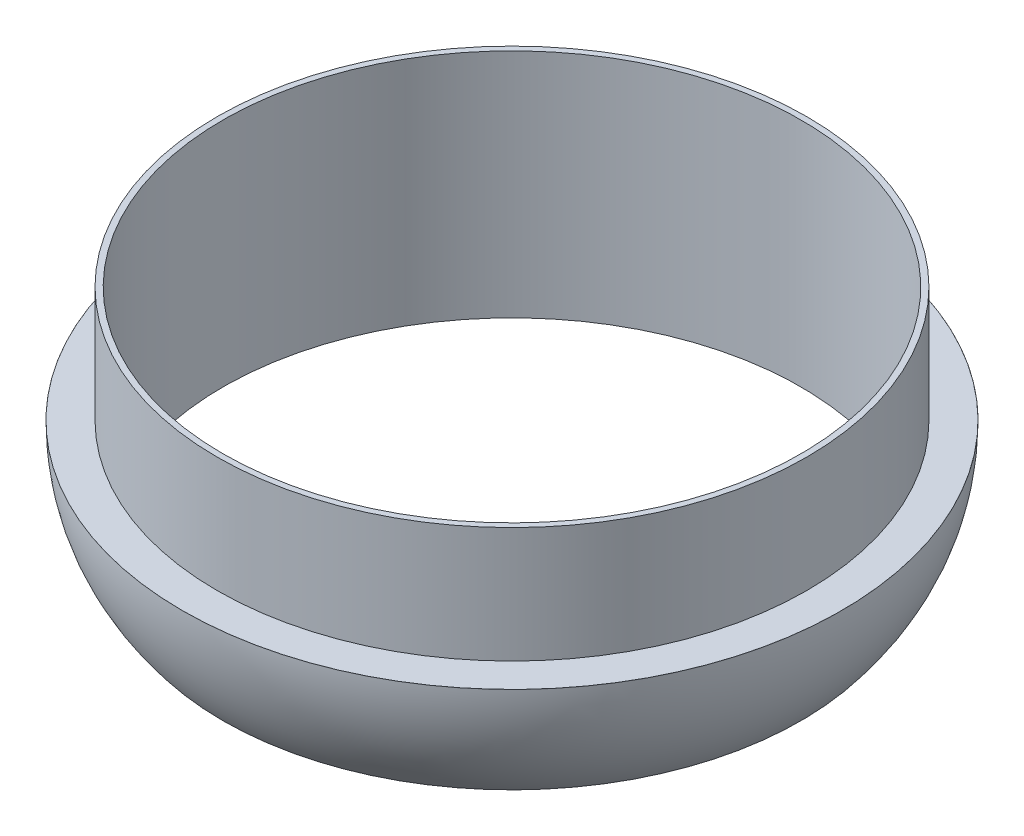
ISO-10303-21;
HEADER;
FILE_DESCRIPTION(('STEP AP214'),'2;1');
FILE_NAME('part.step','',(''),(''),'','','');
FILE_SCHEMA(('AUTOMOTIVE_DESIGN { 1 0 10303 214 1 1 1 1 }'));
ENDSEC;
DATA;
#1=APPLICATION_CONTEXT('core data for automotive mechanical design processes');
#2=APPLICATION_PROTOCOL_DEFINITION('international standard','automotive_design',2000,#1);
#3=PRODUCT_CONTEXT('',#1,'mechanical');
#4=PRODUCT('Part','Part','',(#3));
#5=PRODUCT_RELATED_PRODUCT_CATEGORY('part','',(#4));
#6=PRODUCT_DEFINITION_FORMATION('','',#4);
#7=PRODUCT_DEFINITION_CONTEXT('part definition',#1,'design');
#8=PRODUCT_DEFINITION('design','',#6,#7);
#9=PRODUCT_DEFINITION_SHAPE('','',#8);
#10=(LENGTH_UNIT() NAMED_UNIT(*) SI_UNIT(.MILLI.,.METRE.));
#11=(NAMED_UNIT(*) PLANE_ANGLE_UNIT() SI_UNIT($,.RADIAN.));
#12=(NAMED_UNIT(*) SI_UNIT($,.STERADIAN.) SOLID_ANGLE_UNIT());
#13=UNCERTAINTY_MEASURE_WITH_UNIT(LENGTH_MEASURE(1.E-05),#10,'distance_accuracy_value','');
#14=(GEOMETRIC_REPRESENTATION_CONTEXT(3) GLOBAL_UNCERTAINTY_ASSIGNED_CONTEXT((#13)) GLOBAL_UNIT_ASSIGNED_CONTEXT((#10,
#11,#12)) REPRESENTATION_CONTEXT('',''));
#15=CARTESIAN_POINT('',(0.,0.,0.));
#16=DIRECTION('',(0.,0.,1.));
#17=DIRECTION('',(1.,0.,0.));
#18=AXIS2_PLACEMENT_3D('',#15,#16,#17);
#19=CARTESIAN_POINT('',(0.,10.,0.));
#20=DIRECTION('',(0.,-1.,0.));
#21=DIRECTION('',(0.,0.,-1.));
#22=AXIS2_PLACEMENT_3D('',#19,#20,#21);
#23=CYLINDRICAL_SURFACE('',#22,25.);
#24=CARTESIAN_POINT('',(0.,10.,0.));
#25=DIRECTION('',(0.,1.,0.));
#26=DIRECTION('',(0.,0.,1.));
#27=AXIS2_PLACEMENT_3D('',#24,#25,#26);
#28=CIRCLE('',#27,25.);
#29=CARTESIAN_POINT('',(0.,10.,25.));
#30=VERTEX_POINT('',#29);
#31=EDGE_CURVE('E52',#30,#30,#28,.T.);
#32=ORIENTED_EDGE('',*,*,#31,.T.);
#33=EDGE_LOOP('',(#32));
#34=FACE_BOUND('',#33,.T.);
#35=CARTESIAN_POINT('',(0.,-10.,0.));
#36=DIRECTION('',(0.,1.,0.));
#37=DIRECTION('',(0.,0.,1.));
#38=AXIS2_PLACEMENT_3D('',#35,#36,#37);
#39=CIRCLE('',#38,25.);
#40=CARTESIAN_POINT('',(0.,-10.,25.));
#41=VERTEX_POINT('',#40);
#42=EDGE_CURVE('E61',#41,#41,#39,.T.);
#43=ORIENTED_EDGE('',*,*,#42,.F.);
#44=EDGE_LOOP('',(#43));
#45=FACE_BOUND('',#44,.T.);
#46=ADVANCED_FACE('F41',(#34,#45),#23,.F.);
#47=CARTESIAN_POINT('',(0.,10.,0.));
#48=DIRECTION('',(0.,-1.,0.));
#49=DIRECTION('',(0.,0.,-1.));
#50=AXIS2_PLACEMENT_3D('',#47,#48,#49);
#51=CYLINDRICAL_SURFACE('',#50,25.5);
#52=CARTESIAN_POINT('',(0.,10.,0.));
#53=DIRECTION('',(0.,1.,0.));
#54=DIRECTION('',(0.,0.,1.));
#55=AXIS2_PLACEMENT_3D('',#52,#53,#54);
#56=CIRCLE('',#55,25.5);
#57=CARTESIAN_POINT('',(0.,10.,25.5));
#58=VERTEX_POINT('',#57);
#59=EDGE_CURVE('E48',#58,#58,#56,.T.);
#60=ORIENTED_EDGE('',*,*,#59,.F.);
#61=EDGE_LOOP('',(#60));
#62=FACE_BOUND('',#61,.T.);
#63=CARTESIAN_POINT('',(0.,0.,0.));
#64=DIRECTION('',(0.,1.,0.));
#65=DIRECTION('',(0.,0.,1.));
#66=AXIS2_PLACEMENT_3D('',#63,#64,#65);
#67=CIRCLE('',#66,25.5);
#68=CARTESIAN_POINT('',(0.,0.,25.5));
#69=VERTEX_POINT('',#68);
#70=EDGE_CURVE('E57',#69,#69,#67,.T.);
#71=ORIENTED_EDGE('',*,*,#70,.T.);
#72=EDGE_LOOP('',(#71));
#73=FACE_BOUND('',#72,.T.);
#74=ADVANCED_FACE('F84',(#62,#73),#51,.T.);
#75=CARTESIAN_POINT('',(0.,10.,0.));
#76=DIRECTION('',(0.,1.,0.));
#77=DIRECTION('',(0.,0.,1.));
#78=AXIS2_PLACEMENT_3D('',#75,#76,#77);
#79=PLANE('',#78);
#80=ORIENTED_EDGE('',*,*,#31,.F.);
#81=EDGE_LOOP('',(#80));
#82=FACE_BOUND('',#81,.T.);
#83=ORIENTED_EDGE('',*,*,#59,.T.);
#84=EDGE_LOOP('',(#83));
#85=FACE_BOUND('',#84,.T.);
#86=ADVANCED_FACE('F76',(#82,#85),#79,.T.);
#87=CARTESIAN_POINT('',(0.,-10.,0.));
#88=DIRECTION('',(0.,1.,0.));
#89=DIRECTION('',(0.,0.,1.));
#90=AXIS2_PLACEMENT_3D('',#87,#88,#89);
#91=CYLINDRICAL_SURFACE('',#90,28.5);
#92=CARTESIAN_POINT('',(0.,-0.0125078222809067,0.));
#93=DIRECTION('',(0.,-1.,0.));
#94=DIRECTION('',(0.,0.,-1.));
#95=AXIS2_PLACEMENT_3D('',#92,#93,#94);
#96=CIRCLE('',#95,28.5);
#97=CARTESIAN_POINT('',(0.,-0.0125078222809067,-28.5));
#98=VERTEX_POINT('',#97);
#99=EDGE_CURVE('E12',#98,#98,#96,.F.);
#100=ORIENTED_EDGE('',*,*,#99,.T.);
#101=EDGE_LOOP('',(#100));
#102=FACE_BOUND('',#101,.T.);
#103=CARTESIAN_POINT('',(0.,0.,0.));
#104=DIRECTION('',(0.,1.,0.));
#105=DIRECTION('',(0.,0.,1.));
#106=AXIS2_PLACEMENT_3D('',#103,#104,#105);
#107=CIRCLE('',#106,28.5);
#108=CARTESIAN_POINT('',(0.,0.,28.5));
#109=VERTEX_POINT('',#108);
#110=EDGE_CURVE('E65',#109,#109,#107,.T.);
#111=ORIENTED_EDGE('',*,*,#110,.F.);
#112=EDGE_LOOP('',(#111));
#113=FACE_BOUND('',#112,.T.);
#114=ADVANCED_FACE('F74',(#102,#113),#91,.T.);
#115=CARTESIAN_POINT('',(0.,0.,0.));
#116=DIRECTION('',(0.,1.,0.));
#117=DIRECTION('',(0.,0.,1.));
#118=AXIS2_PLACEMENT_3D('',#115,#116,#117);
#119=PLANE('',#118);
#120=ORIENTED_EDGE('',*,*,#70,.F.);
#121=EDGE_LOOP('',(#120));
#122=FACE_BOUND('',#121,.T.);
#123=ORIENTED_EDGE('',*,*,#110,.T.);
#124=EDGE_LOOP('',(#123));
#125=FACE_BOUND('',#124,.T.);
#126=ADVANCED_FACE('F72',(#122,#125),#119,.T.);
#127=CARTESIAN_POINT('',(0.,-0.0125078222809067,0.));
#128=DIRECTION('',(0.,-1.,0.));
#129=DIRECTION('',(0.,0.,-1.));
#130=AXIS2_PLACEMENT_3D('',#127,#128,#129);
#131=DEGENERATE_TOROIDAL_SURFACE('',#130,12.5,16.,.T.);
#132=ORIENTED_EDGE('',*,*,#42,.T.);
#133=EDGE_LOOP('',(#132));
#134=FACE_BOUND('',#133,.T.);
#135=ORIENTED_EDGE('',*,*,#99,.F.);
#136=EDGE_LOOP('',(#135));
#137=FACE_BOUND('',#136,.T.);
#138=ADVANCED_FACE('F43',(#134,#137),#131,.T.);
#139=CLOSED_SHELL('',(#46,#74,#86,#114,#126,#138));
#140=MANIFOLD_SOLID_BREP('B2',#139);
#141=ADVANCED_BREP_SHAPE_REPRESENTATION('',(#18,#140),#14);
#142=SHAPE_DEFINITION_REPRESENTATION(#9,#141);
ENDSEC;
END-ISO-10303-21;
